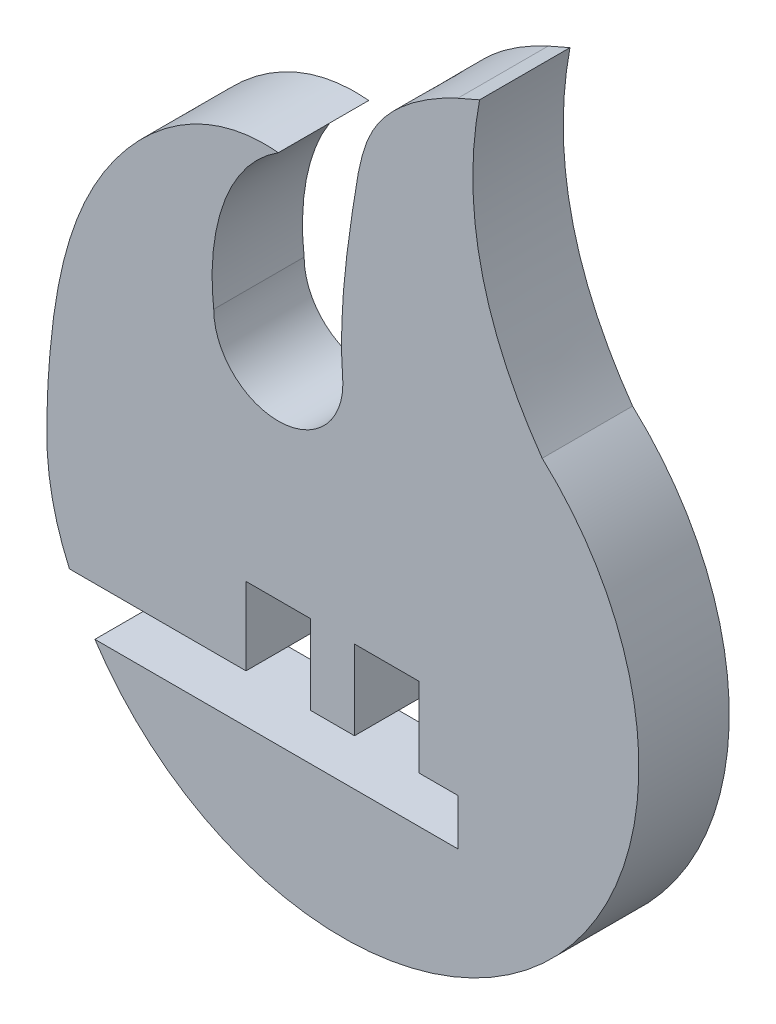
ISO-10303-21;
HEADER;
FILE_DESCRIPTION(('STEP AP214'),'2;1');
FILE_NAME('part.step','',(''),(''),'','','');
FILE_SCHEMA(('AUTOMOTIVE_DESIGN { 1 0 10303 214 1 1 1 1 }'));
ENDSEC;
DATA;
#1=APPLICATION_CONTEXT('core data for automotive mechanical design processes');
#2=APPLICATION_PROTOCOL_DEFINITION('international standard','automotive_design',2000,#1);
#3=PRODUCT_CONTEXT('',#1,'mechanical');
#4=PRODUCT('Part','Part','',(#3));
#5=PRODUCT_RELATED_PRODUCT_CATEGORY('part','',(#4));
#6=PRODUCT_DEFINITION_FORMATION('','',#4);
#7=PRODUCT_DEFINITION_CONTEXT('part definition',#1,'design');
#8=PRODUCT_DEFINITION('design','',#6,#7);
#9=PRODUCT_DEFINITION_SHAPE('','',#8);
#10=(LENGTH_UNIT() NAMED_UNIT(*) SI_UNIT(.MILLI.,.METRE.));
#11=(NAMED_UNIT(*) PLANE_ANGLE_UNIT() SI_UNIT($,.RADIAN.));
#12=(NAMED_UNIT(*) SI_UNIT($,.STERADIAN.) SOLID_ANGLE_UNIT());
#13=UNCERTAINTY_MEASURE_WITH_UNIT(LENGTH_MEASURE(1.E-05),#10,'distance_accuracy_value','');
#14=(GEOMETRIC_REPRESENTATION_CONTEXT(3) GLOBAL_UNCERTAINTY_ASSIGNED_CONTEXT((#13)) GLOBAL_UNIT_ASSIGNED_CONTEXT((#10,
#11,#12)) REPRESENTATION_CONTEXT('',''));
#15=CARTESIAN_POINT('',(0.,0.,0.));
#16=DIRECTION('',(0.,0.,1.));
#17=DIRECTION('',(1.,0.,0.));
#18=AXIS2_PLACEMENT_3D('',#15,#16,#17);
#19=CARTESIAN_POINT('',(3.30689886394365,11.8168831195251,1.40000056394356));
#20=CARTESIAN_POINT('',(2.64861646168988,8.32507374835775,1.40000056394356));
#21=CARTESIAN_POINT('',(4.76171304070229,5.33203682715496,1.40000056394356));
#22=B_SPLINE_CURVE_WITH_KNOTS('',2,(#19,#20,#21),.UNSPECIFIED.,.F.,.F.,(3,3),(0.,1.),.UNSPECIFIED.);
#23=DIRECTION('',(0.,0.,-1.));
#24=VECTOR('',#23,1.);
#25=SURFACE_OF_LINEAR_EXTRUSION('',#22,#24);
#26=CARTESIAN_POINT('',(3.30689886394365,11.8168831195251,-0.699999436056437));
#27=CARTESIAN_POINT('',(2.64861646168988,8.32507374835775,-0.699999436056437));
#28=CARTESIAN_POINT('',(4.76171304070229,5.33203682715496,-0.699999436056437));
#29=B_SPLINE_CURVE_WITH_KNOTS('',2,(#26,#27,#28),.UNSPECIFIED.,.F.,.F.,(3,3),(0.,1.),.UNSPECIFIED.);
#30=CARTESIAN_POINT('',(3.30689886394365,11.8168831195251,-0.699999436056437));
#31=VERTEX_POINT('',#30);
#32=CARTESIAN_POINT('',(4.76171304070229,5.33203682715496,-0.699999436056437));
#33=VERTEX_POINT('',#32);
#34=EDGE_CURVE('E196',#31,#33,#29,.T.);
#35=ORIENTED_EDGE('',*,*,#34,.F.);
#36=DIRECTION('',(0.,0.,-1.));
#37=VECTOR('',#36,1.);
#38=CARTESIAN_POINT('',(3.30689886394365,11.8168831195251,1.40000056394356));
#39=LINE('',#38,#37);
#40=CARTESIAN_POINT('',(3.30689886394365,11.8168831195251,1.40000056394356));
#41=VERTEX_POINT('',#40);
#42=EDGE_CURVE('E11',#41,#31,#39,.T.);
#43=ORIENTED_EDGE('',*,*,#42,.F.);
#44=CARTESIAN_POINT('',(4.76171304070229,5.33203682715496,1.40000056394356));
#45=VERTEX_POINT('',#44);
#46=EDGE_CURVE('E268',#41,#45,#22,.T.);
#47=ORIENTED_EDGE('',*,*,#46,.T.);
#48=DIRECTION('',(0.,0.,-1.));
#49=VECTOR('',#48,1.);
#50=CARTESIAN_POINT('',(4.76171304070229,5.33203682715496,1.40000056394356));
#51=LINE('',#50,#49);
#52=EDGE_CURVE('E122',#45,#33,#51,.T.);
#53=ORIENTED_EDGE('',*,*,#52,.T.);
#54=EDGE_LOOP('',(#35,#43,#47,#53));
#55=FACE_BOUND('',#54,.T.);
#56=ADVANCED_FACE('F37',(#55),#25,.T.);
#57=CARTESIAN_POINT('',(-5.21145934590815,8.1029312072464,1.40000056394356));
#58=DIRECTION('',(-0.399659698021918,0.916663583751983,0.));
#59=DIRECTION('',(-0.916663583751983,-0.399659698021918,0.));
#60=AXIS2_PLACEMENT_3D('',#57,#58,#59);
#61=PLANE('',#60);
#62=DIRECTION('',(0.916663583751983,0.399659698021918,0.));
#63=VECTOR('',#62,1.);
#64=CARTESIAN_POINT('',(-5.21145934590815,8.1029312072464,-0.699999436056437));
#65=LINE('',#64,#63);
#66=CARTESIAN_POINT('',(2.80106030861322,11.5963406131415,-0.699999436056437));
#67=VERTEX_POINT('',#66);
#68=EDGE_CURVE('E201',#67,#31,#65,.T.);
#69=ORIENTED_EDGE('',*,*,#68,.F.);
#70=DIRECTION('',(0.,0.,-1.));
#71=VECTOR('',#70,1.);
#72=CARTESIAN_POINT('',(2.80106030861322,11.5963406131415,1.40000056394356));
#73=LINE('',#72,#71);
#74=CARTESIAN_POINT('',(2.80106030861322,11.5963406131415,1.40000056394356));
#75=VERTEX_POINT('',#74);
#76=EDGE_CURVE('E46',#75,#67,#73,.T.);
#77=ORIENTED_EDGE('',*,*,#76,.F.);
#78=DIRECTION('',(0.916663583751983,0.399659698021918,0.));
#79=VECTOR('',#78,1.);
#80=CARTESIAN_POINT('',(-5.21145934590815,8.1029312072464,1.40000056394356));
#81=LINE('',#80,#79);
#82=EDGE_CURVE('E323',#75,#41,#81,.T.);
#83=ORIENTED_EDGE('',*,*,#82,.T.);
#84=ORIENTED_EDGE('',*,*,#42,.T.);
#85=EDGE_LOOP('',(#69,#77,#83,#84));
#86=FACE_BOUND('',#85,.T.);
#87=ADVANCED_FACE('F311',(#86),#61,.T.);
#88=CARTESIAN_POINT('',(0.131060308613214,4.51532939706609,1.40000056394356));
#89=CARTESIAN_POINT('',(0.0274431141442115,5.8403040912669,1.40000056394356));
#90=CARTESIAN_POINT('',(0.265862067686644,7.59806133636739,1.40000056394356));
#91=CARTESIAN_POINT('',(0.708408380264503,10.3448735154079,1.40000056394356));
#92=CARTESIAN_POINT('',(2.01783231587375,11.2347713757602,1.40000056394356));
#93=CARTESIAN_POINT('',(2.80106030861322,11.5963406131415,1.40000056394356));
#94=B_SPLINE_CURVE_WITH_KNOTS('',3,(#88,#89,#90,#91,#92,#93),.UNSPECIFIED.,.F.,.F.,(4,1,1,4),
(0.,0.483638440660733,0.672292200599917,1.),.UNSPECIFIED.);
#95=DIRECTION('',(0.,0.,-1.));
#96=VECTOR('',#95,1.);
#97=SURFACE_OF_LINEAR_EXTRUSION('',#94,#96);
#98=CARTESIAN_POINT('',(0.131060308613214,4.51532939706609,-0.699999436056437));
#99=CARTESIAN_POINT('',(0.0274431141442115,5.8403040912669,-0.699999436056437));
#100=CARTESIAN_POINT('',(0.265862067686644,7.59806133636739,-0.699999436056437));
#101=CARTESIAN_POINT('',(0.708408380264503,10.3448735154079,-0.699999436056437));
#102=CARTESIAN_POINT('',(2.01783231587375,11.2347713757602,-0.699999436056437));
#103=CARTESIAN_POINT('',(2.80106030861322,11.5963406131415,-0.699999436056437));
#104=B_SPLINE_CURVE_WITH_KNOTS('',3,(#98,#99,#100,#101,#102,#103),.UNSPECIFIED.,.F.,.F.,(4,1,1,
4),(0.,0.483638440660733,0.672292200599917,1.),.UNSPECIFIED.);
#105=CARTESIAN_POINT('',(0.131060308613214,4.51532939706609,-0.699999436056437));
#106=VERTEX_POINT('',#105);
#107=EDGE_CURVE('E207',#106,#67,#104,.T.);
#108=ORIENTED_EDGE('',*,*,#107,.F.);
#109=DIRECTION('',(0.,0.,-1.));
#110=VECTOR('',#109,1.);
#111=CARTESIAN_POINT('',(0.131060308613214,4.51532939706609,1.40000056394356));
#112=LINE('',#111,#110);
#113=CARTESIAN_POINT('',(0.131060308613214,4.51532939706609,1.40000056394356));
#114=VERTEX_POINT('',#113);
#115=EDGE_CURVE('E300',#114,#106,#112,.T.);
#116=ORIENTED_EDGE('',*,*,#115,.F.);
#117=EDGE_CURVE('E307',#114,#75,#94,.T.);
#118=ORIENTED_EDGE('',*,*,#117,.T.);
#119=ORIENTED_EDGE('',*,*,#76,.T.);
#120=EDGE_LOOP('',(#108,#116,#118,#119));
#121=FACE_BOUND('',#120,.T.);
#122=ADVANCED_FACE('F305',(#121),#97,.T.);
#123=CARTESIAN_POINT('',(-1.36893969138679,4.51532939706609,1.40000056394356));
#124=DIRECTION('',(0.,0.,-1.));
#125=DIRECTION('',(-1.,0.,0.));
#126=AXIS2_PLACEMENT_3D('',#123,#124,#125);
#127=CYLINDRICAL_SURFACE('',#126,1.5);
#128=CARTESIAN_POINT('',(-1.36893969138679,4.51532939706609,-0.699999436056437));
#129=DIRECTION('',(0.,0.,1.));
#130=DIRECTION('',(1.,0.,0.));
#131=AXIS2_PLACEMENT_3D('',#128,#129,#130);
#132=CIRCLE('',#131,1.5);
#133=CARTESIAN_POINT('',(-2.86893969138679,4.51532939706609,-0.699999436056437));
#134=VERTEX_POINT('',#133);
#135=EDGE_CURVE('E212',#134,#106,#132,.T.);
#136=ORIENTED_EDGE('',*,*,#135,.F.);
#137=DIRECTION('',(0.,0.,-1.));
#138=VECTOR('',#137,1.);
#139=CARTESIAN_POINT('',(-2.86893969138679,4.51532939706609,1.40000056394356));
#140=LINE('',#139,#138);
#141=CARTESIAN_POINT('',(-2.86893969138679,4.51532939706609,1.40000056394356));
#142=VERTEX_POINT('',#141);
#143=EDGE_CURVE('E298',#142,#134,#140,.T.);
#144=ORIENTED_EDGE('',*,*,#143,.F.);
#145=CARTESIAN_POINT('',(-1.36893969138679,4.51532939706609,1.40000056394356));
#146=DIRECTION('',(0.,0.,1.));
#147=DIRECTION('',(1.,0.,0.));
#148=AXIS2_PLACEMENT_3D('',#145,#146,#147);
#149=CIRCLE('',#148,1.5);
#150=EDGE_CURVE('E320',#142,#114,#149,.T.);
#151=ORIENTED_EDGE('',*,*,#150,.T.);
#152=ORIENTED_EDGE('',*,*,#115,.T.);
#153=EDGE_LOOP('',(#136,#144,#151,#152));
#154=FACE_BOUND('',#153,.T.);
#155=ADVANCED_FACE('F317',(#154),#127,.F.);
#156=CARTESIAN_POINT('',(-1.36893969138679,8.41532939706609,1.40000056394356));
#157=CARTESIAN_POINT('',(-2.6528330052642,7.5990418996473,1.40000056394356));
#158=CARTESIAN_POINT('',(-3.04138967071446,5.93406999364787,1.40000056394356));
#159=CARTESIAN_POINT('',(-2.86893969138679,4.51532939706609,1.40000056394356));
#160=B_SPLINE_CURVE_WITH_KNOTS('',3,(#156,#157,#158,#159),.UNSPECIFIED.,.F.,.F.,(4,4),(0.,1.),.UNSPECIFIED.);
#161=DIRECTION('',(0.,0.,-1.));
#162=VECTOR('',#161,1.);
#163=SURFACE_OF_LINEAR_EXTRUSION('',#160,#162);
#164=CARTESIAN_POINT('',(-1.36893969138679,8.41532939706609,-0.699999436056437));
#165=CARTESIAN_POINT('',(-2.6528330052642,7.5990418996473,-0.699999436056437));
#166=CARTESIAN_POINT('',(-3.04138967071446,5.93406999364787,-0.699999436056437));
#167=CARTESIAN_POINT('',(-2.86893969138679,4.51532939706609,-0.699999436056437));
#168=B_SPLINE_CURVE_WITH_KNOTS('',3,(#164,#165,#166,#167),.UNSPECIFIED.,.F.,.F.,(4,4),(0.,1.),.UNSPECIFIED.);
#169=CARTESIAN_POINT('',(-1.36893969138679,8.41532939706609,-0.699999436056437));
#170=VERTEX_POINT('',#169);
#171=EDGE_CURVE('E218',#170,#134,#168,.T.);
#172=ORIENTED_EDGE('',*,*,#171,.F.);
#173=DIRECTION('',(0.,0.,-1.));
#174=VECTOR('',#173,1.);
#175=CARTESIAN_POINT('',(-1.36893969138679,8.41532939706609,1.40000056394356));
#176=LINE('',#175,#174);
#177=CARTESIAN_POINT('',(-1.36893969138679,8.41532939706609,1.40000056394356));
#178=VERTEX_POINT('',#177);
#179=EDGE_CURVE('E296',#178,#170,#176,.T.);
#180=ORIENTED_EDGE('',*,*,#179,.F.);
#181=EDGE_CURVE('E325',#178,#142,#160,.T.);
#182=ORIENTED_EDGE('',*,*,#181,.T.);
#183=ORIENTED_EDGE('',*,*,#143,.T.);
#184=EDGE_LOOP('',(#172,#180,#182,#183));
#185=FACE_BOUND('',#184,.T.);
#186=ADVANCED_FACE('F469',(#185),#163,.T.);
#187=CARTESIAN_POINT('',(-6.73639744387503,-0.300697589267604,1.40000056394356));
#188=CARTESIAN_POINT('',(-6.76038589012276,0.34636493518121,1.40000056394356));
#189=CARTESIAN_POINT('',(-6.68549370082574,2.38181983216482,1.40000056394356));
#190=CARTESIAN_POINT('',(-5.98724531200817,6.16392055496715,1.40000056394356));
#191=CARTESIAN_POINT('',(-3.18448421721995,8.59412900707834,1.40000056394356));
#192=CARTESIAN_POINT('',(-1.36893969138679,8.41532939706609,1.40000056394356));
#193=B_SPLINE_CURVE_WITH_KNOTS('',3,(#187,#188,#189,#190,#191,#192),.UNSPECIFIED.,.F.,.F.,(4,1,
1,4),(0.156243254406265,0.300823297819268,0.609121373545617,1.),.UNSPECIFIED.);
#194=DIRECTION('',(0.,0.,-1.));
#195=VECTOR('',#194,1.);
#196=SURFACE_OF_LINEAR_EXTRUSION('',#193,#195);
#197=CARTESIAN_POINT('',(-6.73639744387503,-0.300697589267604,-0.699999436056437));
#198=CARTESIAN_POINT('',(-6.76038589012276,0.34636493518121,-0.699999436056437));
#199=CARTESIAN_POINT('',(-6.68549370082574,2.38181983216482,-0.699999436056437));
#200=CARTESIAN_POINT('',(-5.98724531200817,6.16392055496715,-0.699999436056437));
#201=CARTESIAN_POINT('',(-3.18448421721995,8.59412900707834,-0.699999436056437));
#202=CARTESIAN_POINT('',(-1.36893969138679,8.41532939706609,-0.699999436056437));
#203=B_SPLINE_CURVE_WITH_KNOTS('',3,(#197,#198,#199,#200,#201,#202),.UNSPECIFIED.,.F.,.F.,(4,1,
1,4),(0.156243254406265,0.300823297819268,0.609121373545617,1.),.UNSPECIFIED.);
#204=CARTESIAN_POINT('',(-6.73639744387503,-0.300697589267604,-0.699999436056437));
#205=VERTEX_POINT('',#204);
#206=EDGE_CURVE('E223',#205,#170,#203,.T.);
#207=ORIENTED_EDGE('',*,*,#206,.F.);
#208=DIRECTION('',(0.,0.,-1.));
#209=VECTOR('',#208,1.);
#210=CARTESIAN_POINT('',(-6.73639744387503,-0.300697589267604,1.40000056394356));
#211=LINE('',#210,#209);
#212=CARTESIAN_POINT('',(-6.73639744387503,-0.300697589267604,1.40000056394356));
#213=VERTEX_POINT('',#212);
#214=EDGE_CURVE('E294',#213,#205,#211,.T.);
#215=ORIENTED_EDGE('',*,*,#214,.F.);
#216=EDGE_CURVE('E416',#213,#178,#193,.T.);
#217=ORIENTED_EDGE('',*,*,#216,.T.);
#218=ORIENTED_EDGE('',*,*,#179,.T.);
#219=EDGE_LOOP('',(#207,#215,#217,#218));
#220=FACE_BOUND('',#219,.T.);
#221=ADVANCED_FACE('F406',(#220),#196,.T.);
#222=CARTESIAN_POINT('',(-6.22118280026995,-2.38467060293391,1.40000056394356));
#223=CARTESIAN_POINT('',(-6.52052539559862,-1.7229438725199,1.40000056394356));
#224=CARTESIAN_POINT('',(-6.69226258435246,-1.02826491031535,1.40000056394356));
#225=CARTESIAN_POINT('',(-6.73639980420133,-0.300633917826761,1.40000056394356));
#226=B_SPLINE_CURVE_WITH_KNOTS('',3,(#222,#223,#224,#225),.UNSPECIFIED.,.F.,.F.,(4,4),(0.,
0.800781105848046),.UNSPECIFIED.);
#227=DIRECTION('',(0.,0.,-1.));
#228=VECTOR('',#227,1.);
#229=SURFACE_OF_LINEAR_EXTRUSION('',#226,#228);
#230=CARTESIAN_POINT('',(-6.22118280026995,-2.38467060293391,-0.699999436056437));
#231=CARTESIAN_POINT('',(-6.52052539559862,-1.7229438725199,-0.699999436056437));
#232=CARTESIAN_POINT('',(-6.69226258435246,-1.02826491031535,-0.699999436056437));
#233=CARTESIAN_POINT('',(-6.73639980420133,-0.300633917826761,-0.699999436056437));
#234=B_SPLINE_CURVE_WITH_KNOTS('',3,(#230,#231,#232,#233),.UNSPECIFIED.,.F.,.F.,(4,4),(0.,
0.800781105848046),.UNSPECIFIED.);
#235=CARTESIAN_POINT('',(-6.22118280026995,-2.38467060293391,-0.699999436056437));
#236=VERTEX_POINT('',#235);
#237=EDGE_CURVE('E231',#236,#205,#234,.T.);
#238=ORIENTED_EDGE('',*,*,#237,.F.);
#239=DIRECTION('',(0.,0.,-1.));
#240=VECTOR('',#239,1.);
#241=CARTESIAN_POINT('',(-6.22118280026995,-2.38467060293391,1.40000056394356));
#242=LINE('',#241,#240);
#243=CARTESIAN_POINT('',(-6.22118280026995,-2.38467060293391,1.40000056394356));
#244=VERTEX_POINT('',#243);
#245=EDGE_CURVE('E292',#244,#236,#242,.T.);
#246=ORIENTED_EDGE('',*,*,#245,.F.);
#247=EDGE_CURVE('E409',#244,#213,#226,.T.);
#248=ORIENTED_EDGE('',*,*,#247,.T.);
#249=ORIENTED_EDGE('',*,*,#214,.T.);
#250=EDGE_LOOP('',(#238,#246,#248,#249));
#251=FACE_BOUND('',#250,.T.);
#252=ADVANCED_FACE('F401',(#251),#229,.T.);
#253=CARTESIAN_POINT('',(-0.618939691386792,-2.38467060293391,1.40000056394356));
#254=DIRECTION('',(0.,-1.,0.));
#255=DIRECTION('',(1.,0.,0.));
#256=AXIS2_PLACEMENT_3D('',#253,#254,#255);
#257=PLANE('',#256);
#258=DIRECTION('',(-1.,0.,0.));
#259=VECTOR('',#258,1.);
#260=CARTESIAN_POINT('',(-0.618939691386792,-2.38467060293391,-0.699999436056437));
#261=LINE('',#260,#259);
#262=CARTESIAN_POINT('',(-2.11893969138679,-2.38467060293391,-0.699999436056437));
#263=VERTEX_POINT('',#262);
#264=EDGE_CURVE('E239',#263,#236,#261,.T.);
#265=ORIENTED_EDGE('',*,*,#264,.F.);
#266=DIRECTION('',(0.,0.,-1.));
#267=VECTOR('',#266,1.);
#268=CARTESIAN_POINT('',(-2.11893969138679,-2.38467060293391,1.40000056394356));
#269=LINE('',#268,#267);
#270=CARTESIAN_POINT('',(-2.11893969138679,-2.38467060293391,1.40000056394356));
#271=VERTEX_POINT('',#270);
#272=EDGE_CURVE('E290',#271,#263,#269,.T.);
#273=ORIENTED_EDGE('',*,*,#272,.F.);
#274=DIRECTION('',(-1.,0.,0.));
#275=VECTOR('',#274,1.);
#276=CARTESIAN_POINT('',(-0.618939691386792,-2.38467060293391,1.40000056394356));
#277=LINE('',#276,#275);
#278=EDGE_CURVE('E415',#271,#244,#277,.T.);
#279=ORIENTED_EDGE('',*,*,#278,.T.);
#280=ORIENTED_EDGE('',*,*,#245,.T.);
#281=EDGE_LOOP('',(#265,#273,#279,#280));
#282=FACE_BOUND('',#281,.T.);
#283=ADVANCED_FACE('F397',(#282),#257,.T.);
#284=CARTESIAN_POINT('',(-2.11893969138679,-2.43051899001141,1.40000056394356));
#285=DIRECTION('',(1.,0.,0.));
#286=DIRECTION('',(0.,0.,-1.));
#287=AXIS2_PLACEMENT_3D('',#284,#285,#286);
#288=PLANE('',#287);
#289=DIRECTION('',(0.,-1.,0.));
#290=VECTOR('',#289,1.);
#291=CARTESIAN_POINT('',(-2.11893969138679,-2.43051899001141,-0.699999436056437));
#292=LINE('',#291,#290);
#293=CARTESIAN_POINT('',(-2.11893969138679,-0.584670602933909,-0.699999436056437));
#294=VERTEX_POINT('',#293);
#295=EDGE_CURVE('E245',#294,#263,#292,.T.);
#296=ORIENTED_EDGE('',*,*,#295,.F.);
#297=DIRECTION('',(0.,0.,-1.));
#298=VECTOR('',#297,1.);
#299=CARTESIAN_POINT('',(-2.11893969138679,-0.584670602933909,1.40000056394356));
#300=LINE('',#299,#298);
#301=CARTESIAN_POINT('',(-2.11893969138679,-0.584670602933909,1.40000056394356));
#302=VERTEX_POINT('',#301);
#303=EDGE_CURVE('E288',#302,#294,#300,.T.);
#304=ORIENTED_EDGE('',*,*,#303,.F.);
#305=DIRECTION('',(0.,-1.,0.));
#306=VECTOR('',#305,1.);
#307=CARTESIAN_POINT('',(-2.11893969138679,-2.43051899001141,1.40000056394356));
#308=LINE('',#307,#306);
#309=EDGE_CURVE('E425',#302,#271,#308,.T.);
#310=ORIENTED_EDGE('',*,*,#309,.T.);
#311=ORIENTED_EDGE('',*,*,#272,.T.);
#312=EDGE_LOOP('',(#296,#304,#310,#311));
#313=FACE_BOUND('',#312,.T.);
#314=ADVANCED_FACE('F393',(#313),#288,.T.);
#315=CARTESIAN_POINT('',(-0.618939691386793,-0.584670602933909,1.40000056394356));
#316=DIRECTION('',(0.,-1.,0.));
#317=DIRECTION('',(1.,0.,0.));
#318=AXIS2_PLACEMENT_3D('',#315,#316,#317);
#319=PLANE('',#318);
#320=DIRECTION('',(-1.,0.,0.));
#321=VECTOR('',#320,1.);
#322=CARTESIAN_POINT('',(-0.618939691386793,-0.584670602933909,-0.699999436056437));
#323=LINE('',#322,#321);
#324=CARTESIAN_POINT('',(-0.618939691386792,-0.584670602933909,-0.699999436056437));
#325=VERTEX_POINT('',#324);
#326=EDGE_CURVE('E248',#325,#294,#323,.T.);
#327=ORIENTED_EDGE('',*,*,#326,.F.);
#328=DIRECTION('',(0.,0.,-1.));
#329=VECTOR('',#328,1.);
#330=CARTESIAN_POINT('',(-0.618939691386792,-0.584670602933909,1.40000056394356));
#331=LINE('',#330,#329);
#332=CARTESIAN_POINT('',(-0.618939691386792,-0.584670602933909,1.40000056394356));
#333=VERTEX_POINT('',#332);
#334=EDGE_CURVE('E286',#333,#325,#331,.T.);
#335=ORIENTED_EDGE('',*,*,#334,.F.);
#336=DIRECTION('',(-1.,0.,0.));
#337=VECTOR('',#336,1.);
#338=CARTESIAN_POINT('',(-0.618939691386793,-0.584670602933909,1.40000056394356));
#339=LINE('',#338,#337);
#340=EDGE_CURVE('E428',#333,#302,#339,.T.);
#341=ORIENTED_EDGE('',*,*,#340,.T.);
#342=ORIENTED_EDGE('',*,*,#303,.T.);
#343=EDGE_LOOP('',(#327,#335,#341,#342));
#344=FACE_BOUND('',#343,.T.);
#345=ADVANCED_FACE('F389',(#344),#319,.T.);
#346=CARTESIAN_POINT('',(-0.618939691386792,-2.43051899001141,1.40000056394356));
#347=DIRECTION('',(-1.,0.,0.));
#348=DIRECTION('',(0.,0.,1.));
#349=AXIS2_PLACEMENT_3D('',#346,#347,#348);
#350=PLANE('',#349);
#351=DIRECTION('',(0.,1.,0.));
#352=VECTOR('',#351,1.);
#353=CARTESIAN_POINT('',(-0.618939691386792,-2.43051899001141,-0.699999436056437));
#354=LINE('',#353,#352);
#355=CARTESIAN_POINT('',(-0.618939691386792,-2.43051899001141,-0.699999436056437));
#356=VERTEX_POINT('',#355);
#357=EDGE_CURVE('E251',#356,#325,#354,.T.);
#358=ORIENTED_EDGE('',*,*,#357,.F.);
#359=DIRECTION('',(0.,0.,-1.));
#360=VECTOR('',#359,1.);
#361=CARTESIAN_POINT('',(-0.618939691386792,-2.43051899001141,1.40000056394356));
#362=LINE('',#361,#360);
#363=CARTESIAN_POINT('',(-0.618939691386792,-2.43051899001141,1.40000056394356));
#364=VERTEX_POINT('',#363);
#365=EDGE_CURVE('E284',#364,#356,#362,.T.);
#366=ORIENTED_EDGE('',*,*,#365,.F.);
#367=DIRECTION('',(0.,1.,0.));
#368=VECTOR('',#367,1.);
#369=CARTESIAN_POINT('',(-0.618939691386792,-2.43051899001141,1.40000056394356));
#370=LINE('',#369,#368);
#371=EDGE_CURVE('E431',#364,#333,#370,.T.);
#372=ORIENTED_EDGE('',*,*,#371,.T.);
#373=ORIENTED_EDGE('',*,*,#334,.T.);
#374=EDGE_LOOP('',(#358,#366,#372,#373));
#375=FACE_BOUND('',#374,.T.);
#376=ADVANCED_FACE('F385',(#375),#350,.T.);
#377=CARTESIAN_POINT('',(-0.618939691386792,-2.43051899001141,1.40000056394356));
#378=DIRECTION('',(0.,1.,0.));
#379=DIRECTION('',(-1.,0.,0.));
#380=AXIS2_PLACEMENT_3D('',#377,#378,#379);
#381=PLANE('',#380);
#382=DIRECTION('',(1.,0.,0.));
#383=VECTOR('',#382,1.);
#384=CARTESIAN_POINT('',(-0.618939691386792,-2.43051899001141,-0.699999436056437));
#385=LINE('',#384,#383);
#386=CARTESIAN_POINT('',(0.401060308613215,-2.43051899001141,-0.699999436056437));
#387=VERTEX_POINT('',#386);
#388=EDGE_CURVE('E254',#356,#387,#385,.T.);
#389=ORIENTED_EDGE('',*,*,#388,.T.);
#390=DIRECTION('',(0.,0.,-1.));
#391=VECTOR('',#390,1.);
#392=CARTESIAN_POINT('',(0.401060308613215,-2.43051899001141,1.40000056394356));
#393=LINE('',#392,#391);
#394=CARTESIAN_POINT('',(0.401060308613215,-2.43051899001141,1.40000056394356));
#395=VERTEX_POINT('',#394);
#396=EDGE_CURVE('E281',#395,#387,#393,.T.);
#397=ORIENTED_EDGE('',*,*,#396,.F.);
#398=DIRECTION('',(1.,0.,0.));
#399=VECTOR('',#398,1.);
#400=CARTESIAN_POINT('',(-0.618939691386792,-2.43051899001141,1.40000056394356));
#401=LINE('',#400,#399);
#402=EDGE_CURVE('E434',#364,#395,#401,.T.);
#403=ORIENTED_EDGE('',*,*,#402,.F.);
#404=ORIENTED_EDGE('',*,*,#365,.T.);
#405=EDGE_LOOP('',(#389,#397,#403,#404));
#406=FACE_BOUND('',#405,.T.);
#407=ADVANCED_FACE('F381',(#406),#381,.F.);
#408=CARTESIAN_POINT('',(0.401060308613215,-2.43051899001141,1.40000056394356));
#409=DIRECTION('',(-1.,0.,0.));
#410=DIRECTION('',(0.,0.,1.));
#411=AXIS2_PLACEMENT_3D('',#408,#409,#410);
#412=PLANE('',#411);
#413=DIRECTION('',(0.,1.,0.));
#414=VECTOR('',#413,1.);
#415=CARTESIAN_POINT('',(0.401060308613215,-2.43051899001141,-0.699999436056437));
#416=LINE('',#415,#414);
#417=CARTESIAN_POINT('',(0.401060308613215,-0.584670602933908,-0.699999436056437));
#418=VERTEX_POINT('',#417);
#419=EDGE_CURVE('E256',#387,#418,#416,.T.);
#420=ORIENTED_EDGE('',*,*,#419,.T.);
#421=DIRECTION('',(0.,0.,-1.));
#422=VECTOR('',#421,1.);
#423=CARTESIAN_POINT('',(0.401060308613215,-0.584670602933908,1.40000056394356));
#424=LINE('',#423,#422);
#425=CARTESIAN_POINT('',(0.401060308613215,-0.584670602933908,1.40000056394356));
#426=VERTEX_POINT('',#425);
#427=EDGE_CURVE('E278',#426,#418,#424,.T.);
#428=ORIENTED_EDGE('',*,*,#427,.F.);
#429=DIRECTION('',(0.,1.,0.));
#430=VECTOR('',#429,1.);
#431=CARTESIAN_POINT('',(0.401060308613215,-2.43051899001141,1.40000056394356));
#432=LINE('',#431,#430);
#433=EDGE_CURVE('E436',#395,#426,#432,.T.);
#434=ORIENTED_EDGE('',*,*,#433,.F.);
#435=ORIENTED_EDGE('',*,*,#396,.T.);
#436=EDGE_LOOP('',(#420,#428,#434,#435));
#437=FACE_BOUND('',#436,.T.);
#438=ADVANCED_FACE('F377',(#437),#412,.F.);
#439=CARTESIAN_POINT('',(-0.618939691386792,-0.584670602933908,1.40000056394356));
#440=DIRECTION('',(0.,1.,0.));
#441=DIRECTION('',(0.,0.,1.));
#442=AXIS2_PLACEMENT_3D('',#439,#440,#441);
#443=PLANE('',#442);
#444=DIRECTION('',(1.,0.,0.));
#445=VECTOR('',#444,1.);
#446=CARTESIAN_POINT('',(-0.618939691386792,-0.584670602933908,-0.699999436056437));
#447=LINE('',#446,#445);
#448=CARTESIAN_POINT('',(1.90106030861321,-0.584670602933908,-0.699999436056437));
#449=VERTEX_POINT('',#448);
#450=EDGE_CURVE('E258',#418,#449,#447,.T.);
#451=ORIENTED_EDGE('',*,*,#450,.T.);
#452=DIRECTION('',(0.,0.,-1.));
#453=VECTOR('',#452,1.);
#454=CARTESIAN_POINT('',(1.90106030861321,-0.584670602933908,1.40000056394356));
#455=LINE('',#454,#453);
#456=CARTESIAN_POINT('',(1.90106030861321,-0.584670602933908,1.40000056394356));
#457=VERTEX_POINT('',#456);
#458=EDGE_CURVE('E275',#457,#449,#455,.T.);
#459=ORIENTED_EDGE('',*,*,#458,.F.);
#460=DIRECTION('',(1.,0.,0.));
#461=VECTOR('',#460,1.);
#462=CARTESIAN_POINT('',(-0.618939691386792,-0.584670602933908,1.40000056394356));
#463=LINE('',#462,#461);
#464=EDGE_CURVE('E438',#426,#457,#463,.T.);
#465=ORIENTED_EDGE('',*,*,#464,.F.);
#466=ORIENTED_EDGE('',*,*,#427,.T.);
#467=EDGE_LOOP('',(#451,#459,#465,#466));
#468=FACE_BOUND('',#467,.T.);
#469=ADVANCED_FACE('F373',(#468),#443,.F.);
#470=CARTESIAN_POINT('',(1.90106030861321,-2.43051899001141,1.40000056394356));
#471=DIRECTION('',(1.,0.,0.));
#472=DIRECTION('',(0.,0.,-1.));
#473=AXIS2_PLACEMENT_3D('',#470,#471,#472);
#474=PLANE('',#473);
#475=DIRECTION('',(0.,-1.,0.));
#476=VECTOR('',#475,1.);
#477=CARTESIAN_POINT('',(1.90106030861321,-2.43051899001141,-0.699999436056437));
#478=LINE('',#477,#476);
#479=CARTESIAN_POINT('',(1.90106030861321,-2.43051899001141,-0.699999436056437));
#480=VERTEX_POINT('',#479);
#481=EDGE_CURVE('E260',#449,#480,#478,.T.);
#482=ORIENTED_EDGE('',*,*,#481,.T.);
#483=DIRECTION('',(0.,0.,-1.));
#484=VECTOR('',#483,1.);
#485=CARTESIAN_POINT('',(1.90106030861321,-2.43051899001141,1.40000056394356));
#486=LINE('',#485,#484);
#487=CARTESIAN_POINT('',(1.90106030861321,-2.43051899001141,1.40000056394356));
#488=VERTEX_POINT('',#487);
#489=EDGE_CURVE('E272',#488,#480,#486,.T.);
#490=ORIENTED_EDGE('',*,*,#489,.F.);
#491=DIRECTION('',(0.,-1.,0.));
#492=VECTOR('',#491,1.);
#493=CARTESIAN_POINT('',(1.90106030861321,-2.43051899001141,1.40000056394356));
#494=LINE('',#493,#492);
#495=EDGE_CURVE('E440',#457,#488,#494,.T.);
#496=ORIENTED_EDGE('',*,*,#495,.F.);
#497=ORIENTED_EDGE('',*,*,#458,.T.);
#498=EDGE_LOOP('',(#482,#490,#496,#497));
#499=FACE_BOUND('',#498,.T.);
#500=ADVANCED_FACE('F369',(#499),#474,.F.);
#501=CARTESIAN_POINT('',(-0.618939691386792,-2.43051899001141,1.40000056394356));
#502=DIRECTION('',(0.,1.,0.));
#503=DIRECTION('',(-1.,0.,0.));
#504=AXIS2_PLACEMENT_3D('',#501,#502,#503);
#505=PLANE('',#504);
#506=DIRECTION('',(1.,0.,0.));
#507=VECTOR('',#506,1.);
#508=CARTESIAN_POINT('',(-0.618939691386792,-2.43051899001141,-0.699999436056437));
#509=LINE('',#508,#507);
#510=CARTESIAN_POINT('',(2.80106030861321,-2.43051899001141,-0.699999436056437));
#511=VERTEX_POINT('',#510);
#512=EDGE_CURVE('E262',#480,#511,#509,.T.);
#513=ORIENTED_EDGE('',*,*,#512,.T.);
#514=DIRECTION('',(0.,0.,-1.));
#515=VECTOR('',#514,1.);
#516=CARTESIAN_POINT('',(2.80106030861321,-2.43051899001141,1.40000056394356));
#517=LINE('',#516,#515);
#518=CARTESIAN_POINT('',(2.80106030861321,-2.43051899001141,1.40000056394356));
#519=VERTEX_POINT('',#518);
#520=EDGE_CURVE('E188',#519,#511,#517,.T.);
#521=ORIENTED_EDGE('',*,*,#520,.F.);
#522=DIRECTION('',(1.,0.,0.));
#523=VECTOR('',#522,1.);
#524=CARTESIAN_POINT('',(-0.618939691386792,-2.43051899001141,1.40000056394356));
#525=LINE('',#524,#523);
#526=EDGE_CURVE('E179',#488,#519,#525,.T.);
#527=ORIENTED_EDGE('',*,*,#526,.F.);
#528=ORIENTED_EDGE('',*,*,#489,.T.);
#529=EDGE_LOOP('',(#513,#521,#527,#528));
#530=FACE_BOUND('',#529,.T.);
#531=ADVANCED_FACE('F366',(#530),#505,.F.);
#532=CARTESIAN_POINT('',(2.80106030861321,-2.43051899001141,1.40000056394356));
#533=DIRECTION('',(1.,0.,0.));
#534=DIRECTION('',(0.,0.,-1.));
#535=AXIS2_PLACEMENT_3D('',#532,#533,#534);
#536=PLANE('',#535);
#537=DIRECTION('',(0.,-1.,0.));
#538=VECTOR('',#537,1.);
#539=CARTESIAN_POINT('',(2.80106030861321,-2.43051899001141,-0.699999436056437));
#540=LINE('',#539,#538);
#541=CARTESIAN_POINT('',(2.80106030861321,-3.50571241244429,-0.699999436056437));
#542=VERTEX_POINT('',#541);
#543=EDGE_CURVE('E187',#511,#542,#540,.T.);
#544=ORIENTED_EDGE('',*,*,#543,.T.);
#545=DIRECTION('',(0.,0.,-1.));
#546=VECTOR('',#545,1.);
#547=CARTESIAN_POINT('',(2.80106030861321,-3.50571241244429,1.40000056394356));
#548=LINE('',#547,#546);
#549=CARTESIAN_POINT('',(2.80106030861321,-3.50571241244429,1.40000056394356));
#550=VERTEX_POINT('',#549);
#551=EDGE_CURVE('E184',#550,#542,#548,.T.);
#552=ORIENTED_EDGE('',*,*,#551,.F.);
#553=DIRECTION('',(0.,-1.,0.));
#554=VECTOR('',#553,1.);
#555=CARTESIAN_POINT('',(2.80106030861321,-2.43051899001141,1.40000056394356));
#556=LINE('',#555,#554);
#557=EDGE_CURVE('E173',#519,#550,#556,.T.);
#558=ORIENTED_EDGE('',*,*,#557,.F.);
#559=ORIENTED_EDGE('',*,*,#520,.T.);
#560=EDGE_LOOP('',(#544,#552,#558,#559));
#561=FACE_BOUND('',#560,.T.);
#562=ADVANCED_FACE('F185',(#561),#536,.F.);
#563=CARTESIAN_POINT('',(-0.618939691386792,-3.50571241244429,1.40000056394356));
#564=DIRECTION('',(0.,-1.,0.));
#565=DIRECTION('',(0.,0.,-1.));
#566=AXIS2_PLACEMENT_3D('',#563,#564,#565);
#567=PLANE('',#566);
#568=DIRECTION('',(-1.,0.,0.));
#569=VECTOR('',#568,1.);
#570=CARTESIAN_POINT('',(-0.618939691386792,-3.50571241244429,-0.699999436056437));
#571=LINE('',#570,#569);
#572=CARTESIAN_POINT('',(-5.63004772228753,-3.50571241244429,-0.699999436056437));
#573=VERTEX_POINT('',#572);
#574=EDGE_CURVE('E115',#542,#573,#571,.T.);
#575=ORIENTED_EDGE('',*,*,#574,.T.);
#576=DIRECTION('',(0.,0.,-1.));
#577=VECTOR('',#576,1.);
#578=CARTESIAN_POINT('',(-5.63004772228753,-3.50571241244429,1.40000056394356));
#579=LINE('',#578,#577);
#580=CARTESIAN_POINT('',(-5.63004772228753,-3.50571241244429,1.40000056394356));
#581=VERTEX_POINT('',#580);
#582=EDGE_CURVE('E189',#581,#573,#579,.T.);
#583=ORIENTED_EDGE('',*,*,#582,.F.);
#584=DIRECTION('',(-1.,0.,0.));
#585=VECTOR('',#584,1.);
#586=CARTESIAN_POINT('',(-0.618939691386792,-3.50571241244429,1.40000056394356));
#587=LINE('',#586,#585);
#588=EDGE_CURVE('E177',#550,#581,#587,.T.);
#589=ORIENTED_EDGE('',*,*,#588,.F.);
#590=ORIENTED_EDGE('',*,*,#551,.T.);
#591=EDGE_LOOP('',(#575,#583,#589,#590));
#592=FACE_BOUND('',#591,.T.);
#593=ADVANCED_FACE('F191',(#592),#567,.F.);
#594=CARTESIAN_POINT('',(0.131060308613214,0.248546098659444,1.40000056394356));
#595=DIRECTION('',(0.,0.,-1.));
#596=DIRECTION('',(-1.,0.,0.));
#597=AXIS2_PLACEMENT_3D('',#594,#595,#596);
#598=CYLINDRICAL_SURFACE('',#597,6.87639605548603);
#599=CARTESIAN_POINT('',(0.131060308613214,0.248546098659444,-0.699999436056437));
#600=DIRECTION('',(0.,0.,1.));
#601=DIRECTION('',(1.,0.,0.));
#602=AXIS2_PLACEMENT_3D('',#599,#600,#601);
#603=CIRCLE('',#602,6.87639605548603);
#604=EDGE_CURVE('E266',#573,#33,#603,.T.);
#605=ORIENTED_EDGE('',*,*,#604,.T.);
#606=ORIENTED_EDGE('',*,*,#52,.F.);
#607=CARTESIAN_POINT('',(0.131060308613214,0.248546098659444,1.40000056394356));
#608=DIRECTION('',(0.,0.,1.));
#609=DIRECTION('',(1.,0.,0.));
#610=AXIS2_PLACEMENT_3D('',#607,#608,#609);
#611=CIRCLE('',#610,6.87639605548603);
#612=EDGE_CURVE('E54',#581,#45,#611,.T.);
#613=ORIENTED_EDGE('',*,*,#612,.F.);
#614=ORIENTED_EDGE('',*,*,#582,.T.);
#615=EDGE_LOOP('',(#605,#606,#613,#614));
#616=FACE_BOUND('',#615,.T.);
#617=ADVANCED_FACE('F347',(#616),#598,.T.);
#618=CARTESIAN_POINT('',(-0.618939691386792,-2.43051899001141,1.40000056394356));
#619=DIRECTION('',(0.,0.,1.));
#620=DIRECTION('',(1.,0.,0.));
#621=AXIS2_PLACEMENT_3D('',#618,#619,#620);
#622=PLANE('',#621);
#623=ORIENTED_EDGE('',*,*,#46,.F.);
#624=ORIENTED_EDGE('',*,*,#82,.F.);
#625=ORIENTED_EDGE('',*,*,#117,.F.);
#626=ORIENTED_EDGE('',*,*,#150,.F.);
#627=ORIENTED_EDGE('',*,*,#181,.F.);
#628=ORIENTED_EDGE('',*,*,#216,.F.);
#629=ORIENTED_EDGE('',*,*,#247,.F.);
#630=ORIENTED_EDGE('',*,*,#278,.F.);
#631=ORIENTED_EDGE('',*,*,#309,.F.);
#632=ORIENTED_EDGE('',*,*,#340,.F.);
#633=ORIENTED_EDGE('',*,*,#371,.F.);
#634=ORIENTED_EDGE('',*,*,#402,.T.);
#635=ORIENTED_EDGE('',*,*,#433,.T.);
#636=ORIENTED_EDGE('',*,*,#464,.T.);
#637=ORIENTED_EDGE('',*,*,#495,.T.);
#638=ORIENTED_EDGE('',*,*,#526,.T.);
#639=ORIENTED_EDGE('',*,*,#557,.T.);
#640=ORIENTED_EDGE('',*,*,#588,.T.);
#641=ORIENTED_EDGE('',*,*,#612,.T.);
#642=EDGE_LOOP('',(#623,#624,#625,#626,#627,#628,#629,#630,#631,#632,#633,#634,#635,#636,#637,
#638,#639,#640,#641));
#643=FACE_BOUND('',#642,.T.);
#644=ADVANCED_FACE('F175',(#643),#622,.T.);
#645=CARTESIAN_POINT('',(-0.618939691386792,-2.43051899001141,-0.699999436056437));
#646=DIRECTION('',(0.,0.,1.));
#647=DIRECTION('',(1.,0.,0.));
#648=AXIS2_PLACEMENT_3D('',#645,#646,#647);
#649=PLANE('',#648);
#650=ORIENTED_EDGE('',*,*,#34,.T.);
#651=ORIENTED_EDGE('',*,*,#604,.F.);
#652=ORIENTED_EDGE('',*,*,#574,.F.);
#653=ORIENTED_EDGE('',*,*,#543,.F.);
#654=ORIENTED_EDGE('',*,*,#512,.F.);
#655=ORIENTED_EDGE('',*,*,#481,.F.);
#656=ORIENTED_EDGE('',*,*,#450,.F.);
#657=ORIENTED_EDGE('',*,*,#419,.F.);
#658=ORIENTED_EDGE('',*,*,#388,.F.);
#659=ORIENTED_EDGE('',*,*,#357,.T.);
#660=ORIENTED_EDGE('',*,*,#326,.T.);
#661=ORIENTED_EDGE('',*,*,#295,.T.);
#662=ORIENTED_EDGE('',*,*,#264,.T.);
#663=ORIENTED_EDGE('',*,*,#237,.T.);
#664=ORIENTED_EDGE('',*,*,#206,.T.);
#665=ORIENTED_EDGE('',*,*,#171,.T.);
#666=ORIENTED_EDGE('',*,*,#135,.T.);
#667=ORIENTED_EDGE('',*,*,#107,.T.);
#668=ORIENTED_EDGE('',*,*,#68,.T.);
#669=EDGE_LOOP('',(#650,#651,#652,#653,#654,#655,#656,#657,#658,#659,#660,#661,#662,#663,#664,
#665,#666,#667,#668));
#670=FACE_BOUND('',#669,.T.);
#671=ADVANCED_FACE('F313',(#670),#649,.F.);
#672=CLOSED_SHELL('',(#56,#87,#122,#155,#186,#221,#252,#283,#314,#345,#376,#407,#438,#469,#500,
#531,#562,#593,#617,#644,#671));
#673=MANIFOLD_SOLID_BREP('B2',#672);
#674=ADVANCED_BREP_SHAPE_REPRESENTATION('',(#18,#673),#14);
#675=SHAPE_DEFINITION_REPRESENTATION(#9,#674);
ENDSEC;
END-ISO-10303-21;
